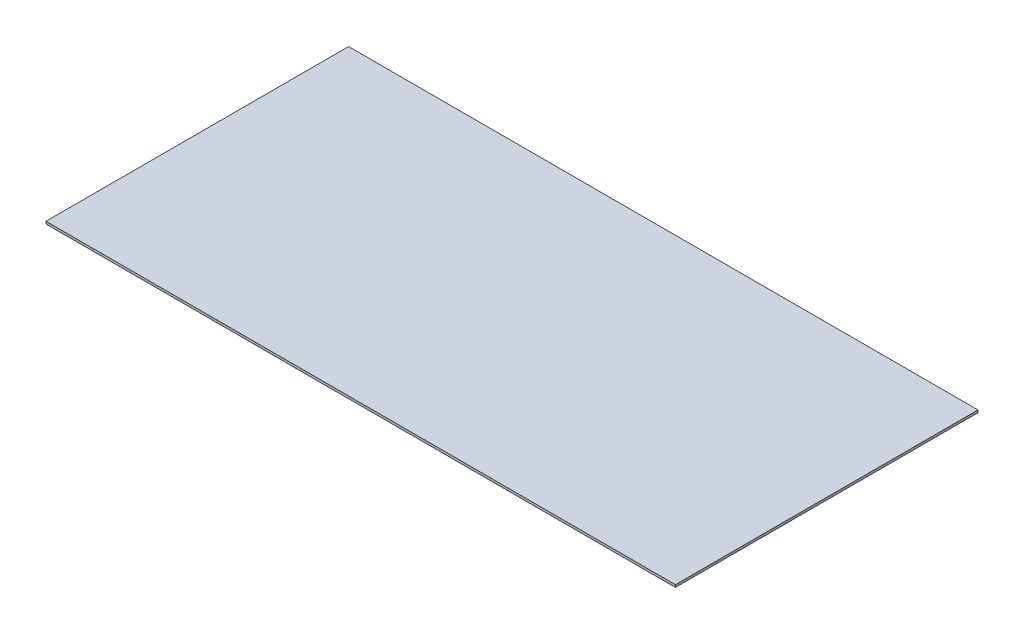
ISO-10303-21;
HEADER;
FILE_DESCRIPTION(('STEP AP214'),'2;1');
FILE_NAME('part.step','',(''),(''),'','','');
FILE_SCHEMA(('AUTOMOTIVE_DESIGN { 1 0 10303 214 1 1 1 1 }'));
ENDSEC;
DATA;
#1=APPLICATION_CONTEXT('core data for automotive mechanical design processes');
#2=APPLICATION_PROTOCOL_DEFINITION('international standard','automotive_design',2000,#1);
#3=PRODUCT_CONTEXT('',#1,'mechanical');
#4=PRODUCT('Part','Part','',(#3));
#5=PRODUCT_RELATED_PRODUCT_CATEGORY('part','',(#4));
#6=PRODUCT_DEFINITION_FORMATION('','',#4);
#7=PRODUCT_DEFINITION_CONTEXT('part definition',#1,'design');
#8=PRODUCT_DEFINITION('design','',#6,#7);
#9=PRODUCT_DEFINITION_SHAPE('','',#8);
#10=(LENGTH_UNIT() NAMED_UNIT(*) SI_UNIT(.MILLI.,.METRE.));
#11=(NAMED_UNIT(*) PLANE_ANGLE_UNIT() SI_UNIT($,.RADIAN.));
#12=(NAMED_UNIT(*) SI_UNIT($,.STERADIAN.) SOLID_ANGLE_UNIT());
#13=UNCERTAINTY_MEASURE_WITH_UNIT(LENGTH_MEASURE(1.E-05),#10,'distance_accuracy_value','');
#14=(GEOMETRIC_REPRESENTATION_CONTEXT(3) GLOBAL_UNCERTAINTY_ASSIGNED_CONTEXT((#13)) GLOBAL_UNIT_ASSIGNED_CONTEXT((#10,
#11,#12)) REPRESENTATION_CONTEXT('',''));
#15=CARTESIAN_POINT('',(0.,0.,0.));
#16=DIRECTION('',(0.,0.,1.));
#17=DIRECTION('',(1.,0.,0.));
#18=AXIS2_PLACEMENT_3D('',#15,#16,#17);
#19=CARTESIAN_POINT('',(2600.,10.,-1250.));
#20=DIRECTION('',(1.,0.,0.));
#21=DIRECTION('',(0.,0.,-1.));
#22=AXIS2_PLACEMENT_3D('',#19,#20,#21);
#23=PLANE('',#22);
#24=DIRECTION('',(0.,1.,0.));
#25=VECTOR('',#24,1.);
#26=CARTESIAN_POINT('',(2600.,10.,0.));
#27=LINE('',#26,#25);
#28=CARTESIAN_POINT('',(2600.,0.,0.));
#29=VERTEX_POINT('',#28);
#30=CARTESIAN_POINT('',(2600.,10.,0.));
#31=VERTEX_POINT('',#30);
#32=EDGE_CURVE('E11',#29,#31,#27,.T.);
#33=ORIENTED_EDGE('',*,*,#32,.F.);
#34=DIRECTION('',(0.,0.,1.));
#35=VECTOR('',#34,1.);
#36=CARTESIAN_POINT('',(2600.,0.,0.));
#37=LINE('',#36,#35);
#38=CARTESIAN_POINT('',(2600.,0.,-1250.));
#39=VERTEX_POINT('',#38);
#40=EDGE_CURVE('E93',#29,#39,#37,.F.);
#41=ORIENTED_EDGE('',*,*,#40,.T.);
#42=DIRECTION('',(0.,1.,0.));
#43=VECTOR('',#42,1.);
#44=CARTESIAN_POINT('',(2600.,10.,-1250.));
#45=LINE('',#44,#43);
#46=CARTESIAN_POINT('',(2600.,10.,-1250.));
#47=VERTEX_POINT('',#46);
#48=EDGE_CURVE('E49',#39,#47,#45,.T.);
#49=ORIENTED_EDGE('',*,*,#48,.T.);
#50=DIRECTION('',(0.,0.,-1.));
#51=VECTOR('',#50,1.);
#52=CARTESIAN_POINT('',(2600.,10.,-1250.));
#53=LINE('',#52,#51);
#54=EDGE_CURVE('E106',#31,#47,#53,.T.);
#55=ORIENTED_EDGE('',*,*,#54,.F.);
#56=EDGE_LOOP('',(#33,#41,#49,#55));
#57=FACE_BOUND('',#56,.T.);
#58=ADVANCED_FACE('F39',(#57),#23,.T.);
#59=CARTESIAN_POINT('',(-1.48256740304088E-13,10.,-1250.));
#60=DIRECTION('',(0.,0.,-1.));
#61=DIRECTION('',(-1.,0.,0.));
#62=AXIS2_PLACEMENT_3D('',#59,#60,#61);
#63=PLANE('',#62);
#64=ORIENTED_EDGE('',*,*,#48,.F.);
#65=DIRECTION('',(1.,0.,0.));
#66=VECTOR('',#65,1.);
#67=CARTESIAN_POINT('',(0.,0.,-1250.));
#68=LINE('',#67,#66);
#69=CARTESIAN_POINT('',(-1.48256740304088E-13,0.,-1250.));
#70=VERTEX_POINT('',#69);
#71=EDGE_CURVE('E100',#39,#70,#68,.F.);
#72=ORIENTED_EDGE('',*,*,#71,.T.);
#73=DIRECTION('',(0.,1.,0.));
#74=VECTOR('',#73,1.);
#75=CARTESIAN_POINT('',(-1.48256740304088E-13,10.,-1250.));
#76=LINE('',#75,#74);
#77=CARTESIAN_POINT('',(-1.48256740304088E-13,10.,-1250.));
#78=VERTEX_POINT('',#77);
#79=EDGE_CURVE('E57',#70,#78,#76,.T.);
#80=ORIENTED_EDGE('',*,*,#79,.T.);
#81=DIRECTION('',(-1.,0.,0.));
#82=VECTOR('',#81,1.);
#83=CARTESIAN_POINT('',(-1.48256740304088E-13,10.,-1250.));
#84=LINE('',#83,#82);
#85=EDGE_CURVE('E87',#47,#78,#84,.T.);
#86=ORIENTED_EDGE('',*,*,#85,.F.);
#87=EDGE_LOOP('',(#64,#72,#80,#86));
#88=FACE_BOUND('',#87,.T.);
#89=ADVANCED_FACE('F110',(#88),#63,.T.);
#90=CARTESIAN_POINT('',(-1.48256740304088E-13,10.,-1250.));
#91=DIRECTION('',(-1.,0.,0.));
#92=DIRECTION('',(0.,0.,1.));
#93=AXIS2_PLACEMENT_3D('',#90,#91,#92);
#94=PLANE('',#93);
#95=ORIENTED_EDGE('',*,*,#79,.F.);
#96=DIRECTION('',(0.,0.,1.));
#97=VECTOR('',#96,1.);
#98=CARTESIAN_POINT('',(-1.48256740304088E-13,0.,0.));
#99=LINE('',#98,#97);
#100=CARTESIAN_POINT('',(0.,0.,0.));
#101=VERTEX_POINT('',#100);
#102=EDGE_CURVE('E92',#70,#101,#99,.T.);
#103=ORIENTED_EDGE('',*,*,#102,.T.);
#104=DIRECTION('',(0.,1.,0.));
#105=VECTOR('',#104,1.);
#106=CARTESIAN_POINT('',(0.,10.,0.));
#107=LINE('',#106,#105);
#108=CARTESIAN_POINT('',(0.,10.,0.));
#109=VERTEX_POINT('',#108);
#110=EDGE_CURVE('E43',#101,#109,#107,.T.);
#111=ORIENTED_EDGE('',*,*,#110,.T.);
#112=DIRECTION('',(0.,0.,1.));
#113=VECTOR('',#112,1.);
#114=CARTESIAN_POINT('',(-1.48256740304088E-13,10.,-1250.));
#115=LINE('',#114,#113);
#116=EDGE_CURVE('E102',#78,#109,#115,.T.);
#117=ORIENTED_EDGE('',*,*,#116,.F.);
#118=EDGE_LOOP('',(#95,#103,#111,#117));
#119=FACE_BOUND('',#118,.T.);
#120=ADVANCED_FACE('F95',(#119),#94,.T.);
#121=CARTESIAN_POINT('',(0.,10.,0.));
#122=DIRECTION('',(0.,0.,1.));
#123=DIRECTION('',(1.,0.,0.));
#124=AXIS2_PLACEMENT_3D('',#121,#122,#123);
#125=PLANE('',#124);
#126=DIRECTION('',(1.,0.,0.));
#127=VECTOR('',#126,1.);
#128=CARTESIAN_POINT('',(0.,0.,0.));
#129=LINE('',#128,#127);
#130=EDGE_CURVE('E81',#101,#29,#129,.T.);
#131=ORIENTED_EDGE('',*,*,#130,.T.);
#132=ORIENTED_EDGE('',*,*,#32,.T.);
#133=DIRECTION('',(1.,0.,0.));
#134=VECTOR('',#133,1.);
#135=CARTESIAN_POINT('',(0.,10.,0.));
#136=LINE('',#135,#134);
#137=EDGE_CURVE('E83',#109,#31,#136,.T.);
#138=ORIENTED_EDGE('',*,*,#137,.F.);
#139=ORIENTED_EDGE('',*,*,#110,.F.);
#140=EDGE_LOOP('',(#131,#132,#138,#139));
#141=FACE_BOUND('',#140,.T.);
#142=ADVANCED_FACE('F41',(#141),#125,.T.);
#143=CARTESIAN_POINT('',(0.,10.,0.));
#144=DIRECTION('',(0.,1.,0.));
#145=DIRECTION('',(0.,0.,1.));
#146=AXIS2_PLACEMENT_3D('',#143,#144,#145);
#147=PLANE('',#146);
#148=ORIENTED_EDGE('',*,*,#116,.T.);
#149=ORIENTED_EDGE('',*,*,#137,.T.);
#150=ORIENTED_EDGE('',*,*,#54,.T.);
#151=ORIENTED_EDGE('',*,*,#85,.T.);
#152=EDGE_LOOP('',(#148,#149,#150,#151));
#153=FACE_BOUND('',#152,.T.);
#154=ADVANCED_FACE('F109',(#153),#147,.T.);
#155=CARTESIAN_POINT('',(0.,0.,0.));
#156=DIRECTION('',(0.,1.,0.));
#157=DIRECTION('',(0.,0.,1.));
#158=AXIS2_PLACEMENT_3D('',#155,#156,#157);
#159=PLANE('',#158);
#160=ORIENTED_EDGE('',*,*,#102,.F.);
#161=ORIENTED_EDGE('',*,*,#71,.F.);
#162=ORIENTED_EDGE('',*,*,#40,.F.);
#163=ORIENTED_EDGE('',*,*,#130,.F.);
#164=EDGE_LOOP('',(#160,#161,#162,#163));
#165=FACE_BOUND('',#164,.T.);
#166=ADVANCED_FACE('F90',(#165),#159,.F.);
#167=CLOSED_SHELL('',(#58,#89,#120,#142,#154,#166));
#168=MANIFOLD_SOLID_BREP('B2',#167);
#169=ADVANCED_BREP_SHAPE_REPRESENTATION('',(#18,#168),#14);
#170=SHAPE_DEFINITION_REPRESENTATION(#9,#169);
ENDSEC;
END-ISO-10303-21;
